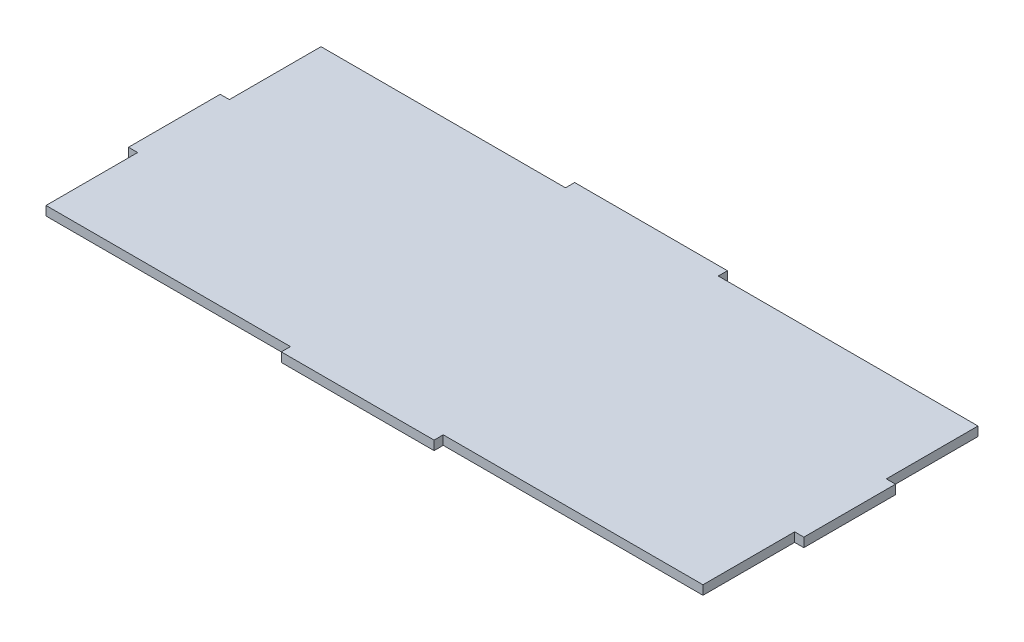
ISO-10303-21;
HEADER;
FILE_DESCRIPTION(('STEP AP214'),'2;1');
FILE_NAME('part.step','',(''),(''),'','','');
FILE_SCHEMA(('AUTOMOTIVE_DESIGN { 1 0 10303 214 1 1 1 1 }'));
ENDSEC;
DATA;
#1=APPLICATION_CONTEXT('core data for automotive mechanical design processes');
#2=APPLICATION_PROTOCOL_DEFINITION('international standard','automotive_design',2000,#1);
#3=PRODUCT_CONTEXT('',#1,'mechanical');
#4=PRODUCT('Part','Part','',(#3));
#5=PRODUCT_RELATED_PRODUCT_CATEGORY('part','',(#4));
#6=PRODUCT_DEFINITION_FORMATION('','',#4);
#7=PRODUCT_DEFINITION_CONTEXT('part definition',#1,'design');
#8=PRODUCT_DEFINITION('design','',#6,#7);
#9=PRODUCT_DEFINITION_SHAPE('','',#8);
#10=(LENGTH_UNIT() NAMED_UNIT(*) SI_UNIT(.MILLI.,.METRE.));
#11=(NAMED_UNIT(*) PLANE_ANGLE_UNIT() SI_UNIT($,.RADIAN.));
#12=(NAMED_UNIT(*) SI_UNIT($,.STERADIAN.) SOLID_ANGLE_UNIT());
#13=UNCERTAINTY_MEASURE_WITH_UNIT(LENGTH_MEASURE(1.E-05),#10,'distance_accuracy_value','');
#14=(GEOMETRIC_REPRESENTATION_CONTEXT(3) GLOBAL_UNCERTAINTY_ASSIGNED_CONTEXT((#13)) GLOBAL_UNIT_ASSIGNED_CONTEXT((#10,
#11,#12)) REPRESENTATION_CONTEXT('',''));
#15=CARTESIAN_POINT('',(0.,0.,0.));
#16=DIRECTION('',(0.,0.,1.));
#17=DIRECTION('',(1.,0.,0.));
#18=AXIS2_PLACEMENT_3D('',#15,#16,#17);
#19=CARTESIAN_POINT('',(0.,3.,0.));
#20=DIRECTION('',(1.,0.,0.));
#21=DIRECTION('',(0.,0.,-1.));
#22=AXIS2_PLACEMENT_3D('',#19,#20,#21);
#23=PLANE('',#22);
#24=DIRECTION('',(0.,0.,1.));
#25=VECTOR('',#24,1.);
#26=CARTESIAN_POINT('',(0.,0.,0.));
#27=LINE('',#26,#25);
#28=CARTESIAN_POINT('',(0.,0.,-30.));
#29=VERTEX_POINT('',#28);
#30=CARTESIAN_POINT('',(0.,0.,0.));
#31=VERTEX_POINT('',#30);
#32=EDGE_CURVE('E201',#29,#31,#27,.T.);
#33=ORIENTED_EDGE('',*,*,#32,.T.);
#34=DIRECTION('',(0.,-1.,0.));
#35=VECTOR('',#34,1.);
#36=CARTESIAN_POINT('',(0.,3.,0.));
#37=LINE('',#36,#35);
#38=CARTESIAN_POINT('',(0.,3.,0.));
#39=VERTEX_POINT('',#38);
#40=EDGE_CURVE('E11',#39,#31,#37,.T.);
#41=ORIENTED_EDGE('',*,*,#40,.F.);
#42=DIRECTION('',(0.,0.,1.));
#43=VECTOR('',#42,1.);
#44=CARTESIAN_POINT('',(0.,3.,0.));
#45=LINE('',#44,#43);
#46=CARTESIAN_POINT('',(0.,3.,-30.));
#47=VERTEX_POINT('',#46);
#48=EDGE_CURVE('E239',#47,#39,#45,.T.);
#49=ORIENTED_EDGE('',*,*,#48,.F.);
#50=DIRECTION('',(0.,-1.,0.));
#51=VECTOR('',#50,1.);
#52=CARTESIAN_POINT('',(0.,3.,-30.));
#53=LINE('',#52,#51);
#54=EDGE_CURVE('E197',#47,#29,#53,.T.);
#55=ORIENTED_EDGE('',*,*,#54,.T.);
#56=EDGE_LOOP('',(#33,#41,#49,#55));
#57=FACE_BOUND('',#56,.T.);
#58=ADVANCED_FACE('F33',(#57),#23,.F.);
#59=CARTESIAN_POINT('',(0.,3.,0.));
#60=DIRECTION('',(0.,0.,-1.));
#61=DIRECTION('',(-1.,0.,0.));
#62=AXIS2_PLACEMENT_3D('',#59,#60,#61);
#63=PLANE('',#62);
#64=DIRECTION('',(1.,0.,0.));
#65=VECTOR('',#64,1.);
#66=CARTESIAN_POINT('',(0.,0.,0.));
#67=LINE('',#66,#65);
#68=CARTESIAN_POINT('',(80.,0.,0.));
#69=VERTEX_POINT('',#68);
#70=EDGE_CURVE('E204',#31,#69,#67,.T.);
#71=ORIENTED_EDGE('',*,*,#70,.T.);
#72=DIRECTION('',(0.,-1.,0.));
#73=VECTOR('',#72,1.);
#74=CARTESIAN_POINT('',(80.,3.,0.));
#75=LINE('',#74,#73);
#76=CARTESIAN_POINT('',(80.,3.,0.));
#77=VERTEX_POINT('',#76);
#78=EDGE_CURVE('E41',#77,#69,#75,.T.);
#79=ORIENTED_EDGE('',*,*,#78,.F.);
#80=DIRECTION('',(1.,0.,0.));
#81=VECTOR('',#80,1.);
#82=CARTESIAN_POINT('',(0.,3.,0.));
#83=LINE('',#82,#81);
#84=EDGE_CURVE('E128',#39,#77,#83,.T.);
#85=ORIENTED_EDGE('',*,*,#84,.F.);
#86=ORIENTED_EDGE('',*,*,#40,.T.);
#87=EDGE_LOOP('',(#71,#79,#85,#86));
#88=FACE_BOUND('',#87,.T.);
#89=ADVANCED_FACE('F357',(#88),#63,.F.);
#90=CARTESIAN_POINT('',(80.,3.,0.));
#91=DIRECTION('',(1.,0.,0.));
#92=DIRECTION('',(0.,0.,-1.));
#93=AXIS2_PLACEMENT_3D('',#90,#91,#92);
#94=PLANE('',#93);
#95=DIRECTION('',(0.,0.,1.));
#96=VECTOR('',#95,1.);
#97=CARTESIAN_POINT('',(80.,0.,0.));
#98=LINE('',#97,#96);
#99=CARTESIAN_POINT('',(80.,0.,3.));
#100=VERTEX_POINT('',#99);
#101=EDGE_CURVE('E206',#69,#100,#98,.T.);
#102=ORIENTED_EDGE('',*,*,#101,.T.);
#103=DIRECTION('',(0.,-1.,0.));
#104=VECTOR('',#103,1.);
#105=CARTESIAN_POINT('',(80.,3.,3.));
#106=LINE('',#105,#104);
#107=CARTESIAN_POINT('',(80.,3.,3.));
#108=VERTEX_POINT('',#107);
#109=EDGE_CURVE('E282',#108,#100,#106,.T.);
#110=ORIENTED_EDGE('',*,*,#109,.F.);
#111=DIRECTION('',(0.,0.,1.));
#112=VECTOR('',#111,1.);
#113=CARTESIAN_POINT('',(80.,3.,0.));
#114=LINE('',#113,#112);
#115=EDGE_CURVE('E290',#77,#108,#114,.T.);
#116=ORIENTED_EDGE('',*,*,#115,.F.);
#117=ORIENTED_EDGE('',*,*,#78,.T.);
#118=EDGE_LOOP('',(#102,#110,#116,#117));
#119=FACE_BOUND('',#118,.T.);
#120=ADVANCED_FACE('F288',(#119),#94,.F.);
#121=CARTESIAN_POINT('',(80.,3.,3.));
#122=DIRECTION('',(0.,0.,-1.));
#123=DIRECTION('',(-1.,0.,0.));
#124=AXIS2_PLACEMENT_3D('',#121,#122,#123);
#125=PLANE('',#124);
#126=DIRECTION('',(1.,0.,0.));
#127=VECTOR('',#126,1.);
#128=CARTESIAN_POINT('',(80.,0.,3.));
#129=LINE('',#128,#127);
#130=CARTESIAN_POINT('',(130.,0.,3.));
#131=VERTEX_POINT('',#130);
#132=EDGE_CURVE('E208',#100,#131,#129,.T.);
#133=ORIENTED_EDGE('',*,*,#132,.T.);
#134=DIRECTION('',(0.,-1.,0.));
#135=VECTOR('',#134,1.);
#136=CARTESIAN_POINT('',(130.,3.,3.));
#137=LINE('',#136,#135);
#138=CARTESIAN_POINT('',(130.,3.,3.));
#139=VERTEX_POINT('',#138);
#140=EDGE_CURVE('E279',#139,#131,#137,.T.);
#141=ORIENTED_EDGE('',*,*,#140,.F.);
#142=DIRECTION('',(1.,0.,0.));
#143=VECTOR('',#142,1.);
#144=CARTESIAN_POINT('',(80.,3.,3.));
#145=LINE('',#144,#143);
#146=EDGE_CURVE('E308',#108,#139,#145,.T.);
#147=ORIENTED_EDGE('',*,*,#146,.F.);
#148=ORIENTED_EDGE('',*,*,#109,.T.);
#149=EDGE_LOOP('',(#133,#141,#147,#148));
#150=FACE_BOUND('',#149,.T.);
#151=ADVANCED_FACE('F299',(#150),#125,.F.);
#152=CARTESIAN_POINT('',(130.,3.,0.));
#153=DIRECTION('',(-1.,0.,0.));
#154=DIRECTION('',(0.,0.,1.));
#155=AXIS2_PLACEMENT_3D('',#152,#153,#154);
#156=PLANE('',#155);
#157=DIRECTION('',(0.,0.,-1.));
#158=VECTOR('',#157,1.);
#159=CARTESIAN_POINT('',(130.,0.,0.));
#160=LINE('',#159,#158);
#161=CARTESIAN_POINT('',(130.,0.,0.));
#162=VERTEX_POINT('',#161);
#163=EDGE_CURVE('E210',#131,#162,#160,.T.);
#164=ORIENTED_EDGE('',*,*,#163,.T.);
#165=DIRECTION('',(0.,-1.,0.));
#166=VECTOR('',#165,1.);
#167=CARTESIAN_POINT('',(130.,3.,0.));
#168=LINE('',#167,#166);
#169=CARTESIAN_POINT('',(130.,3.,0.));
#170=VERTEX_POINT('',#169);
#171=EDGE_CURVE('E276',#170,#162,#168,.T.);
#172=ORIENTED_EDGE('',*,*,#171,.F.);
#173=DIRECTION('',(0.,0.,-1.));
#174=VECTOR('',#173,1.);
#175=CARTESIAN_POINT('',(130.,3.,0.));
#176=LINE('',#175,#174);
#177=EDGE_CURVE('E305',#139,#170,#176,.T.);
#178=ORIENTED_EDGE('',*,*,#177,.F.);
#179=ORIENTED_EDGE('',*,*,#140,.T.);
#180=EDGE_LOOP('',(#164,#172,#178,#179));
#181=FACE_BOUND('',#180,.T.);
#182=ADVANCED_FACE('F303',(#181),#156,.F.);
#183=CARTESIAN_POINT('',(130.,3.,0.));
#184=DIRECTION('',(0.,0.,-1.));
#185=DIRECTION('',(-1.,0.,0.));
#186=AXIS2_PLACEMENT_3D('',#183,#184,#185);
#187=PLANE('',#186);
#188=DIRECTION('',(1.,0.,0.));
#189=VECTOR('',#188,1.);
#190=CARTESIAN_POINT('',(130.,0.,0.));
#191=LINE('',#190,#189);
#192=CARTESIAN_POINT('',(215.,0.,0.));
#193=VERTEX_POINT('',#192);
#194=EDGE_CURVE('E212',#162,#193,#191,.T.);
#195=ORIENTED_EDGE('',*,*,#194,.T.);
#196=DIRECTION('',(0.,-1.,0.));
#197=VECTOR('',#196,1.);
#198=CARTESIAN_POINT('',(215.,3.,0.));
#199=LINE('',#198,#197);
#200=CARTESIAN_POINT('',(215.,3.,0.));
#201=VERTEX_POINT('',#200);
#202=EDGE_CURVE('E273',#201,#193,#199,.T.);
#203=ORIENTED_EDGE('',*,*,#202,.F.);
#204=DIRECTION('',(1.,0.,0.));
#205=VECTOR('',#204,1.);
#206=CARTESIAN_POINT('',(130.,3.,0.));
#207=LINE('',#206,#205);
#208=EDGE_CURVE('E307',#170,#201,#207,.T.);
#209=ORIENTED_EDGE('',*,*,#208,.F.);
#210=ORIENTED_EDGE('',*,*,#171,.T.);
#211=EDGE_LOOP('',(#195,#203,#209,#210));
#212=FACE_BOUND('',#211,.T.);
#213=ADVANCED_FACE('F370',(#212),#187,.F.);
#214=CARTESIAN_POINT('',(215.,3.,0.));
#215=DIRECTION('',(-1.,0.,0.));
#216=DIRECTION('',(0.,0.,1.));
#217=AXIS2_PLACEMENT_3D('',#214,#215,#216);
#218=PLANE('',#217);
#219=DIRECTION('',(0.,0.,-1.));
#220=VECTOR('',#219,1.);
#221=CARTESIAN_POINT('',(215.,0.,0.));
#222=LINE('',#221,#220);
#223=CARTESIAN_POINT('',(215.,0.,-30.));
#224=VERTEX_POINT('',#223);
#225=EDGE_CURVE('E214',#193,#224,#222,.T.);
#226=ORIENTED_EDGE('',*,*,#225,.T.);
#227=DIRECTION('',(0.,-1.,0.));
#228=VECTOR('',#227,1.);
#229=CARTESIAN_POINT('',(215.,3.,-30.));
#230=LINE('',#229,#228);
#231=CARTESIAN_POINT('',(215.,3.,-30.));
#232=VERTEX_POINT('',#231);
#233=EDGE_CURVE('E270',#232,#224,#230,.T.);
#234=ORIENTED_EDGE('',*,*,#233,.F.);
#235=DIRECTION('',(0.,0.,-1.));
#236=VECTOR('',#235,1.);
#237=CARTESIAN_POINT('',(215.,3.,0.));
#238=LINE('',#237,#236);
#239=EDGE_CURVE('E310',#201,#232,#238,.T.);
#240=ORIENTED_EDGE('',*,*,#239,.F.);
#241=ORIENTED_EDGE('',*,*,#202,.T.);
#242=EDGE_LOOP('',(#226,#234,#240,#241));
#243=FACE_BOUND('',#242,.T.);
#244=ADVANCED_FACE('F373',(#243),#218,.F.);
#245=CARTESIAN_POINT('',(215.,3.,-30.));
#246=DIRECTION('',(0.,0.,-1.));
#247=DIRECTION('',(-1.,0.,0.));
#248=AXIS2_PLACEMENT_3D('',#245,#246,#247);
#249=PLANE('',#248);
#250=DIRECTION('',(1.,0.,0.));
#251=VECTOR('',#250,1.);
#252=CARTESIAN_POINT('',(215.,0.,-30.));
#253=LINE('',#252,#251);
#254=CARTESIAN_POINT('',(218.,0.,-30.));
#255=VERTEX_POINT('',#254);
#256=EDGE_CURVE('E216',#224,#255,#253,.T.);
#257=ORIENTED_EDGE('',*,*,#256,.T.);
#258=DIRECTION('',(0.,-1.,0.));
#259=VECTOR('',#258,1.);
#260=CARTESIAN_POINT('',(218.,3.,-30.));
#261=LINE('',#260,#259);
#262=CARTESIAN_POINT('',(218.,3.,-30.));
#263=VERTEX_POINT('',#262);
#264=EDGE_CURVE('E267',#263,#255,#261,.T.);
#265=ORIENTED_EDGE('',*,*,#264,.F.);
#266=DIRECTION('',(1.,0.,0.));
#267=VECTOR('',#266,1.);
#268=CARTESIAN_POINT('',(215.,3.,-30.));
#269=LINE('',#268,#267);
#270=EDGE_CURVE('E316',#232,#263,#269,.T.);
#271=ORIENTED_EDGE('',*,*,#270,.F.);
#272=ORIENTED_EDGE('',*,*,#233,.T.);
#273=EDGE_LOOP('',(#257,#265,#271,#272));
#274=FACE_BOUND('',#273,.T.);
#275=ADVANCED_FACE('F377',(#274),#249,.F.);
#276=CARTESIAN_POINT('',(218.,3.,-60.));
#277=DIRECTION('',(-1.,0.,0.));
#278=DIRECTION('',(0.,0.,1.));
#279=AXIS2_PLACEMENT_3D('',#276,#277,#278);
#280=PLANE('',#279);
#281=DIRECTION('',(0.,0.,-1.));
#282=VECTOR('',#281,1.);
#283=CARTESIAN_POINT('',(218.,0.,-60.));
#284=LINE('',#283,#282);
#285=CARTESIAN_POINT('',(218.,0.,-60.));
#286=VERTEX_POINT('',#285);
#287=EDGE_CURVE('E218',#255,#286,#284,.T.);
#288=ORIENTED_EDGE('',*,*,#287,.T.);
#289=DIRECTION('',(0.,-1.,0.));
#290=VECTOR('',#289,1.);
#291=CARTESIAN_POINT('',(218.,3.,-60.));
#292=LINE('',#291,#290);
#293=CARTESIAN_POINT('',(218.,3.,-60.));
#294=VERTEX_POINT('',#293);
#295=EDGE_CURVE('E264',#294,#286,#292,.T.);
#296=ORIENTED_EDGE('',*,*,#295,.F.);
#297=DIRECTION('',(0.,0.,-1.));
#298=VECTOR('',#297,1.);
#299=CARTESIAN_POINT('',(218.,3.,-60.));
#300=LINE('',#299,#298);
#301=EDGE_CURVE('E318',#263,#294,#300,.T.);
#302=ORIENTED_EDGE('',*,*,#301,.F.);
#303=ORIENTED_EDGE('',*,*,#264,.T.);
#304=EDGE_LOOP('',(#288,#296,#302,#303));
#305=FACE_BOUND('',#304,.T.);
#306=ADVANCED_FACE('F381',(#305),#280,.F.);
#307=CARTESIAN_POINT('',(215.,3.,-60.));
#308=DIRECTION('',(0.,0.,1.));
#309=DIRECTION('',(1.,0.,0.));
#310=AXIS2_PLACEMENT_3D('',#307,#308,#309);
#311=PLANE('',#310);
#312=DIRECTION('',(-1.,0.,0.));
#313=VECTOR('',#312,1.);
#314=CARTESIAN_POINT('',(215.,0.,-60.));
#315=LINE('',#314,#313);
#316=CARTESIAN_POINT('',(215.,0.,-60.));
#317=VERTEX_POINT('',#316);
#318=EDGE_CURVE('E220',#286,#317,#315,.T.);
#319=ORIENTED_EDGE('',*,*,#318,.T.);
#320=DIRECTION('',(0.,-1.,0.));
#321=VECTOR('',#320,1.);
#322=CARTESIAN_POINT('',(215.,3.,-60.));
#323=LINE('',#322,#321);
#324=CARTESIAN_POINT('',(215.,3.,-60.));
#325=VERTEX_POINT('',#324);
#326=EDGE_CURVE('E261',#325,#317,#323,.T.);
#327=ORIENTED_EDGE('',*,*,#326,.F.);
#328=DIRECTION('',(-1.,0.,0.));
#329=VECTOR('',#328,1.);
#330=CARTESIAN_POINT('',(215.,3.,-60.));
#331=LINE('',#330,#329);
#332=EDGE_CURVE('E320',#294,#325,#331,.T.);
#333=ORIENTED_EDGE('',*,*,#332,.F.);
#334=ORIENTED_EDGE('',*,*,#295,.T.);
#335=EDGE_LOOP('',(#319,#327,#333,#334));
#336=FACE_BOUND('',#335,.T.);
#337=ADVANCED_FACE('F385',(#336),#311,.F.);
#338=CARTESIAN_POINT('',(215.,3.,-60.));
#339=DIRECTION('',(-1.,0.,0.));
#340=DIRECTION('',(0.,0.,1.));
#341=AXIS2_PLACEMENT_3D('',#338,#339,#340);
#342=PLANE('',#341);
#343=DIRECTION('',(0.,0.,-1.));
#344=VECTOR('',#343,1.);
#345=CARTESIAN_POINT('',(215.,0.,-60.));
#346=LINE('',#345,#344);
#347=CARTESIAN_POINT('',(215.,0.,-90.));
#348=VERTEX_POINT('',#347);
#349=EDGE_CURVE('E222',#317,#348,#346,.T.);
#350=ORIENTED_EDGE('',*,*,#349,.T.);
#351=DIRECTION('',(0.,-1.,0.));
#352=VECTOR('',#351,1.);
#353=CARTESIAN_POINT('',(215.,3.,-90.));
#354=LINE('',#353,#352);
#355=CARTESIAN_POINT('',(215.,3.,-90.));
#356=VERTEX_POINT('',#355);
#357=EDGE_CURVE('E258',#356,#348,#354,.T.);
#358=ORIENTED_EDGE('',*,*,#357,.F.);
#359=DIRECTION('',(0.,0.,-1.));
#360=VECTOR('',#359,1.);
#361=CARTESIAN_POINT('',(215.,3.,-60.));
#362=LINE('',#361,#360);
#363=EDGE_CURVE('E322',#325,#356,#362,.T.);
#364=ORIENTED_EDGE('',*,*,#363,.F.);
#365=ORIENTED_EDGE('',*,*,#326,.T.);
#366=EDGE_LOOP('',(#350,#358,#364,#365));
#367=FACE_BOUND('',#366,.T.);
#368=ADVANCED_FACE('F389',(#367),#342,.F.);
#369=CARTESIAN_POINT('',(130.,3.,-90.));
#370=DIRECTION('',(0.,0.,1.));
#371=DIRECTION('',(1.,0.,0.));
#372=AXIS2_PLACEMENT_3D('',#369,#370,#371);
#373=PLANE('',#372);
#374=DIRECTION('',(-1.,0.,0.));
#375=VECTOR('',#374,1.);
#376=CARTESIAN_POINT('',(130.,0.,-90.));
#377=LINE('',#376,#375);
#378=CARTESIAN_POINT('',(130.,0.,-90.));
#379=VERTEX_POINT('',#378);
#380=EDGE_CURVE('E224',#348,#379,#377,.T.);
#381=ORIENTED_EDGE('',*,*,#380,.T.);
#382=DIRECTION('',(0.,-1.,0.));
#383=VECTOR('',#382,1.);
#384=CARTESIAN_POINT('',(130.,3.,-90.));
#385=LINE('',#384,#383);
#386=CARTESIAN_POINT('',(130.,3.,-90.));
#387=VERTEX_POINT('',#386);
#388=EDGE_CURVE('E255',#387,#379,#385,.T.);
#389=ORIENTED_EDGE('',*,*,#388,.F.);
#390=DIRECTION('',(-1.,0.,0.));
#391=VECTOR('',#390,1.);
#392=CARTESIAN_POINT('',(130.,3.,-90.));
#393=LINE('',#392,#391);
#394=EDGE_CURVE('E324',#356,#387,#393,.T.);
#395=ORIENTED_EDGE('',*,*,#394,.F.);
#396=ORIENTED_EDGE('',*,*,#357,.T.);
#397=EDGE_LOOP('',(#381,#389,#395,#396));
#398=FACE_BOUND('',#397,.T.);
#399=ADVANCED_FACE('F393',(#398),#373,.F.);
#400=CARTESIAN_POINT('',(130.,3.,-90.));
#401=DIRECTION('',(-1.,0.,0.));
#402=DIRECTION('',(0.,0.,1.));
#403=AXIS2_PLACEMENT_3D('',#400,#401,#402);
#404=PLANE('',#403);
#405=DIRECTION('',(0.,0.,-1.));
#406=VECTOR('',#405,1.);
#407=CARTESIAN_POINT('',(130.,0.,-90.));
#408=LINE('',#407,#406);
#409=CARTESIAN_POINT('',(130.,0.,-93.));
#410=VERTEX_POINT('',#409);
#411=EDGE_CURVE('E226',#379,#410,#408,.T.);
#412=ORIENTED_EDGE('',*,*,#411,.T.);
#413=DIRECTION('',(0.,-1.,0.));
#414=VECTOR('',#413,1.);
#415=CARTESIAN_POINT('',(130.,3.,-93.));
#416=LINE('',#415,#414);
#417=CARTESIAN_POINT('',(130.,3.,-93.));
#418=VERTEX_POINT('',#417);
#419=EDGE_CURVE('E252',#418,#410,#416,.T.);
#420=ORIENTED_EDGE('',*,*,#419,.F.);
#421=DIRECTION('',(0.,0.,-1.));
#422=VECTOR('',#421,1.);
#423=CARTESIAN_POINT('',(130.,3.,-90.));
#424=LINE('',#423,#422);
#425=EDGE_CURVE('E326',#387,#418,#424,.T.);
#426=ORIENTED_EDGE('',*,*,#425,.F.);
#427=ORIENTED_EDGE('',*,*,#388,.T.);
#428=EDGE_LOOP('',(#412,#420,#426,#427));
#429=FACE_BOUND('',#428,.T.);
#430=ADVANCED_FACE('F397',(#429),#404,.F.);
#431=CARTESIAN_POINT('',(80.,3.,-93.));
#432=DIRECTION('',(0.,0.,1.));
#433=DIRECTION('',(1.,0.,0.));
#434=AXIS2_PLACEMENT_3D('',#431,#432,#433);
#435=PLANE('',#434);
#436=DIRECTION('',(-1.,0.,0.));
#437=VECTOR('',#436,1.);
#438=CARTESIAN_POINT('',(80.,0.,-93.));
#439=LINE('',#438,#437);
#440=CARTESIAN_POINT('',(80.,0.,-93.));
#441=VERTEX_POINT('',#440);
#442=EDGE_CURVE('E228',#410,#441,#439,.T.);
#443=ORIENTED_EDGE('',*,*,#442,.T.);
#444=DIRECTION('',(0.,-1.,0.));
#445=VECTOR('',#444,1.);
#446=CARTESIAN_POINT('',(80.,3.,-93.));
#447=LINE('',#446,#445);
#448=CARTESIAN_POINT('',(80.,3.,-93.));
#449=VERTEX_POINT('',#448);
#450=EDGE_CURVE('E249',#449,#441,#447,.T.);
#451=ORIENTED_EDGE('',*,*,#450,.F.);
#452=DIRECTION('',(-1.,0.,0.));
#453=VECTOR('',#452,1.);
#454=CARTESIAN_POINT('',(80.,3.,-93.));
#455=LINE('',#454,#453);
#456=EDGE_CURVE('E328',#418,#449,#455,.T.);
#457=ORIENTED_EDGE('',*,*,#456,.F.);
#458=ORIENTED_EDGE('',*,*,#419,.T.);
#459=EDGE_LOOP('',(#443,#451,#457,#458));
#460=FACE_BOUND('',#459,.T.);
#461=ADVANCED_FACE('F401',(#460),#435,.F.);
#462=CARTESIAN_POINT('',(80.,3.,-90.));
#463=DIRECTION('',(1.,0.,0.));
#464=DIRECTION('',(0.,0.,-1.));
#465=AXIS2_PLACEMENT_3D('',#462,#463,#464);
#466=PLANE('',#465);
#467=DIRECTION('',(0.,0.,1.));
#468=VECTOR('',#467,1.);
#469=CARTESIAN_POINT('',(80.,0.,-90.));
#470=LINE('',#469,#468);
#471=CARTESIAN_POINT('',(80.,0.,-90.));
#472=VERTEX_POINT('',#471);
#473=EDGE_CURVE('E230',#441,#472,#470,.T.);
#474=ORIENTED_EDGE('',*,*,#473,.T.);
#475=DIRECTION('',(0.,-1.,0.));
#476=VECTOR('',#475,1.);
#477=CARTESIAN_POINT('',(80.,3.,-90.));
#478=LINE('',#477,#476);
#479=CARTESIAN_POINT('',(80.,3.,-90.));
#480=VERTEX_POINT('',#479);
#481=EDGE_CURVE('E246',#480,#472,#478,.T.);
#482=ORIENTED_EDGE('',*,*,#481,.F.);
#483=DIRECTION('',(0.,0.,1.));
#484=VECTOR('',#483,1.);
#485=CARTESIAN_POINT('',(80.,3.,-90.));
#486=LINE('',#485,#484);
#487=EDGE_CURVE('E330',#449,#480,#486,.T.);
#488=ORIENTED_EDGE('',*,*,#487,.F.);
#489=ORIENTED_EDGE('',*,*,#450,.T.);
#490=EDGE_LOOP('',(#474,#482,#488,#489));
#491=FACE_BOUND('',#490,.T.);
#492=ADVANCED_FACE('F405',(#491),#466,.F.);
#493=CARTESIAN_POINT('',(0.,3.,-90.));
#494=DIRECTION('',(0.,0.,1.));
#495=DIRECTION('',(1.,0.,0.));
#496=AXIS2_PLACEMENT_3D('',#493,#494,#495);
#497=PLANE('',#496);
#498=DIRECTION('',(-1.,0.,0.));
#499=VECTOR('',#498,1.);
#500=CARTESIAN_POINT('',(0.,0.,-90.));
#501=LINE('',#500,#499);
#502=CARTESIAN_POINT('',(0.,0.,-90.));
#503=VERTEX_POINT('',#502);
#504=EDGE_CURVE('E232',#472,#503,#501,.T.);
#505=ORIENTED_EDGE('',*,*,#504,.T.);
#506=DIRECTION('',(0.,-1.,0.));
#507=VECTOR('',#506,1.);
#508=CARTESIAN_POINT('',(0.,3.,-90.));
#509=LINE('',#508,#507);
#510=CARTESIAN_POINT('',(0.,3.,-90.));
#511=VERTEX_POINT('',#510);
#512=EDGE_CURVE('E243',#511,#503,#509,.T.);
#513=ORIENTED_EDGE('',*,*,#512,.F.);
#514=DIRECTION('',(-1.,0.,0.));
#515=VECTOR('',#514,1.);
#516=CARTESIAN_POINT('',(0.,3.,-90.));
#517=LINE('',#516,#515);
#518=EDGE_CURVE('E332',#480,#511,#517,.T.);
#519=ORIENTED_EDGE('',*,*,#518,.F.);
#520=ORIENTED_EDGE('',*,*,#481,.T.);
#521=EDGE_LOOP('',(#505,#513,#519,#520));
#522=FACE_BOUND('',#521,.T.);
#523=ADVANCED_FACE('F338',(#522),#497,.F.);
#524=CARTESIAN_POINT('',(0.,3.,-60.));
#525=DIRECTION('',(1.,0.,0.));
#526=DIRECTION('',(0.,0.,-1.));
#527=AXIS2_PLACEMENT_3D('',#524,#525,#526);
#528=PLANE('',#527);
#529=DIRECTION('',(0.,0.,1.));
#530=VECTOR('',#529,1.);
#531=CARTESIAN_POINT('',(0.,0.,-60.));
#532=LINE('',#531,#530);
#533=CARTESIAN_POINT('',(0.,0.,-60.));
#534=VERTEX_POINT('',#533);
#535=EDGE_CURVE('E234',#503,#534,#532,.T.);
#536=ORIENTED_EDGE('',*,*,#535,.T.);
#537=DIRECTION('',(0.,-1.,0.));
#538=VECTOR('',#537,1.);
#539=CARTESIAN_POINT('',(0.,3.,-60.));
#540=LINE('',#539,#538);
#541=CARTESIAN_POINT('',(0.,3.,-60.));
#542=VERTEX_POINT('',#541);
#543=EDGE_CURVE('E192',#542,#534,#540,.T.);
#544=ORIENTED_EDGE('',*,*,#543,.F.);
#545=DIRECTION('',(0.,0.,1.));
#546=VECTOR('',#545,1.);
#547=CARTESIAN_POINT('',(0.,3.,-60.));
#548=LINE('',#547,#546);
#549=EDGE_CURVE('E183',#511,#542,#548,.T.);
#550=ORIENTED_EDGE('',*,*,#549,.F.);
#551=ORIENTED_EDGE('',*,*,#512,.T.);
#552=EDGE_LOOP('',(#536,#544,#550,#551));
#553=FACE_BOUND('',#552,.T.);
#554=ADVANCED_FACE('F342',(#553),#528,.F.);
#555=CARTESIAN_POINT('',(0.,3.,-60.));
#556=DIRECTION('',(0.,0.,1.));
#557=DIRECTION('',(1.,0.,0.));
#558=AXIS2_PLACEMENT_3D('',#555,#556,#557);
#559=PLANE('',#558);
#560=DIRECTION('',(-1.,0.,0.));
#561=VECTOR('',#560,1.);
#562=CARTESIAN_POINT('',(0.,0.,-60.));
#563=LINE('',#562,#561);
#564=CARTESIAN_POINT('',(-3.,0.,-60.));
#565=VERTEX_POINT('',#564);
#566=EDGE_CURVE('E191',#534,#565,#563,.T.);
#567=ORIENTED_EDGE('',*,*,#566,.T.);
#568=DIRECTION('',(0.,-1.,0.));
#569=VECTOR('',#568,1.);
#570=CARTESIAN_POINT('',(-3.,3.,-60.));
#571=LINE('',#570,#569);
#572=CARTESIAN_POINT('',(-3.,3.,-60.));
#573=VERTEX_POINT('',#572);
#574=EDGE_CURVE('E188',#573,#565,#571,.T.);
#575=ORIENTED_EDGE('',*,*,#574,.F.);
#576=DIRECTION('',(-1.,0.,0.));
#577=VECTOR('',#576,1.);
#578=CARTESIAN_POINT('',(0.,3.,-60.));
#579=LINE('',#578,#577);
#580=EDGE_CURVE('E177',#542,#573,#579,.T.);
#581=ORIENTED_EDGE('',*,*,#580,.F.);
#582=ORIENTED_EDGE('',*,*,#543,.T.);
#583=EDGE_LOOP('',(#567,#575,#581,#582));
#584=FACE_BOUND('',#583,.T.);
#585=ADVANCED_FACE('F189',(#584),#559,.F.);
#586=CARTESIAN_POINT('',(-3.,3.,-60.));
#587=DIRECTION('',(1.,0.,0.));
#588=DIRECTION('',(0.,0.,-1.));
#589=AXIS2_PLACEMENT_3D('',#586,#587,#588);
#590=PLANE('',#589);
#591=DIRECTION('',(0.,0.,1.));
#592=VECTOR('',#591,1.);
#593=CARTESIAN_POINT('',(-3.,0.,-60.));
#594=LINE('',#593,#592);
#595=CARTESIAN_POINT('',(-3.,0.,-30.));
#596=VERTEX_POINT('',#595);
#597=EDGE_CURVE('E114',#565,#596,#594,.T.);
#598=ORIENTED_EDGE('',*,*,#597,.T.);
#599=DIRECTION('',(0.,-1.,0.));
#600=VECTOR('',#599,1.);
#601=CARTESIAN_POINT('',(-3.,3.,-30.));
#602=LINE('',#601,#600);
#603=CARTESIAN_POINT('',(-3.,3.,-30.));
#604=VERTEX_POINT('',#603);
#605=EDGE_CURVE('E193',#604,#596,#602,.T.);
#606=ORIENTED_EDGE('',*,*,#605,.F.);
#607=DIRECTION('',(0.,0.,1.));
#608=VECTOR('',#607,1.);
#609=CARTESIAN_POINT('',(-3.,3.,-60.));
#610=LINE('',#609,#608);
#611=EDGE_CURVE('E181',#573,#604,#610,.T.);
#612=ORIENTED_EDGE('',*,*,#611,.F.);
#613=ORIENTED_EDGE('',*,*,#574,.T.);
#614=EDGE_LOOP('',(#598,#606,#612,#613));
#615=FACE_BOUND('',#614,.T.);
#616=ADVANCED_FACE('F195',(#615),#590,.F.);
#617=CARTESIAN_POINT('',(0.,3.,-30.));
#618=DIRECTION('',(0.,0.,-1.));
#619=DIRECTION('',(-1.,0.,0.));
#620=AXIS2_PLACEMENT_3D('',#617,#618,#619);
#621=PLANE('',#620);
#622=DIRECTION('',(1.,0.,0.));
#623=VECTOR('',#622,1.);
#624=CARTESIAN_POINT('',(0.,0.,-30.));
#625=LINE('',#624,#623);
#626=EDGE_CURVE('E120',#596,#29,#625,.T.);
#627=ORIENTED_EDGE('',*,*,#626,.T.);
#628=ORIENTED_EDGE('',*,*,#54,.F.);
#629=DIRECTION('',(1.,0.,0.));
#630=VECTOR('',#629,1.);
#631=CARTESIAN_POINT('',(0.,3.,-30.));
#632=LINE('',#631,#630);
#633=EDGE_CURVE('E49',#604,#47,#632,.T.);
#634=ORIENTED_EDGE('',*,*,#633,.F.);
#635=ORIENTED_EDGE('',*,*,#605,.T.);
#636=EDGE_LOOP('',(#627,#628,#634,#635));
#637=FACE_BOUND('',#636,.T.);
#638=ADVANCED_FACE('F346',(#637),#621,.F.);
#639=CARTESIAN_POINT('',(0.,3.,0.));
#640=DIRECTION('',(0.,1.,0.));
#641=DIRECTION('',(0.,0.,1.));
#642=AXIS2_PLACEMENT_3D('',#639,#640,#641);
#643=PLANE('',#642);
#644=ORIENTED_EDGE('',*,*,#48,.T.);
#645=ORIENTED_EDGE('',*,*,#84,.T.);
#646=ORIENTED_EDGE('',*,*,#115,.T.);
#647=ORIENTED_EDGE('',*,*,#146,.T.);
#648=ORIENTED_EDGE('',*,*,#177,.T.);
#649=ORIENTED_EDGE('',*,*,#208,.T.);
#650=ORIENTED_EDGE('',*,*,#239,.T.);
#651=ORIENTED_EDGE('',*,*,#270,.T.);
#652=ORIENTED_EDGE('',*,*,#301,.T.);
#653=ORIENTED_EDGE('',*,*,#332,.T.);
#654=ORIENTED_EDGE('',*,*,#363,.T.);
#655=ORIENTED_EDGE('',*,*,#394,.T.);
#656=ORIENTED_EDGE('',*,*,#425,.T.);
#657=ORIENTED_EDGE('',*,*,#456,.T.);
#658=ORIENTED_EDGE('',*,*,#487,.T.);
#659=ORIENTED_EDGE('',*,*,#518,.T.);
#660=ORIENTED_EDGE('',*,*,#549,.T.);
#661=ORIENTED_EDGE('',*,*,#580,.T.);
#662=ORIENTED_EDGE('',*,*,#611,.T.);
#663=ORIENTED_EDGE('',*,*,#633,.T.);
#664=EDGE_LOOP('',(#644,#645,#646,#647,#648,#649,#650,#651,#652,#653,#654,#655,#656,#657,#658,
#659,#660,#661,#662,#663));
#665=FACE_BOUND('',#664,.T.);
#666=ADVANCED_FACE('F179',(#665),#643,.T.);
#667=CARTESIAN_POINT('',(0.,0.,0.));
#668=DIRECTION('',(0.,1.,0.));
#669=DIRECTION('',(0.,0.,1.));
#670=AXIS2_PLACEMENT_3D('',#667,#668,#669);
#671=PLANE('',#670);
#672=ORIENTED_EDGE('',*,*,#32,.F.);
#673=ORIENTED_EDGE('',*,*,#626,.F.);
#674=ORIENTED_EDGE('',*,*,#597,.F.);
#675=ORIENTED_EDGE('',*,*,#566,.F.);
#676=ORIENTED_EDGE('',*,*,#535,.F.);
#677=ORIENTED_EDGE('',*,*,#504,.F.);
#678=ORIENTED_EDGE('',*,*,#473,.F.);
#679=ORIENTED_EDGE('',*,*,#442,.F.);
#680=ORIENTED_EDGE('',*,*,#411,.F.);
#681=ORIENTED_EDGE('',*,*,#380,.F.);
#682=ORIENTED_EDGE('',*,*,#349,.F.);
#683=ORIENTED_EDGE('',*,*,#318,.F.);
#684=ORIENTED_EDGE('',*,*,#287,.F.);
#685=ORIENTED_EDGE('',*,*,#256,.F.);
#686=ORIENTED_EDGE('',*,*,#225,.F.);
#687=ORIENTED_EDGE('',*,*,#194,.F.);
#688=ORIENTED_EDGE('',*,*,#163,.F.);
#689=ORIENTED_EDGE('',*,*,#132,.F.);
#690=ORIENTED_EDGE('',*,*,#101,.F.);
#691=ORIENTED_EDGE('',*,*,#70,.F.);
#692=EDGE_LOOP('',(#672,#673,#674,#675,#676,#677,#678,#679,#680,#681,#682,#683,#684,#685,#686,
#687,#688,#689,#690,#691));
#693=FACE_BOUND('',#692,.T.);
#694=ADVANCED_FACE('F294',(#693),#671,.F.);
#695=CLOSED_SHELL('',(#58,#89,#120,#151,#182,#213,#244,#275,#306,#337,#368,#399,#430,#461,#492,
#523,#554,#585,#616,#638,#666,#694));
#696=MANIFOLD_SOLID_BREP('B2',#695);
#697=ADVANCED_BREP_SHAPE_REPRESENTATION('',(#18,#696),#14);
#698=SHAPE_DEFINITION_REPRESENTATION(#9,#697);
ENDSEC;
END-ISO-10303-21;
